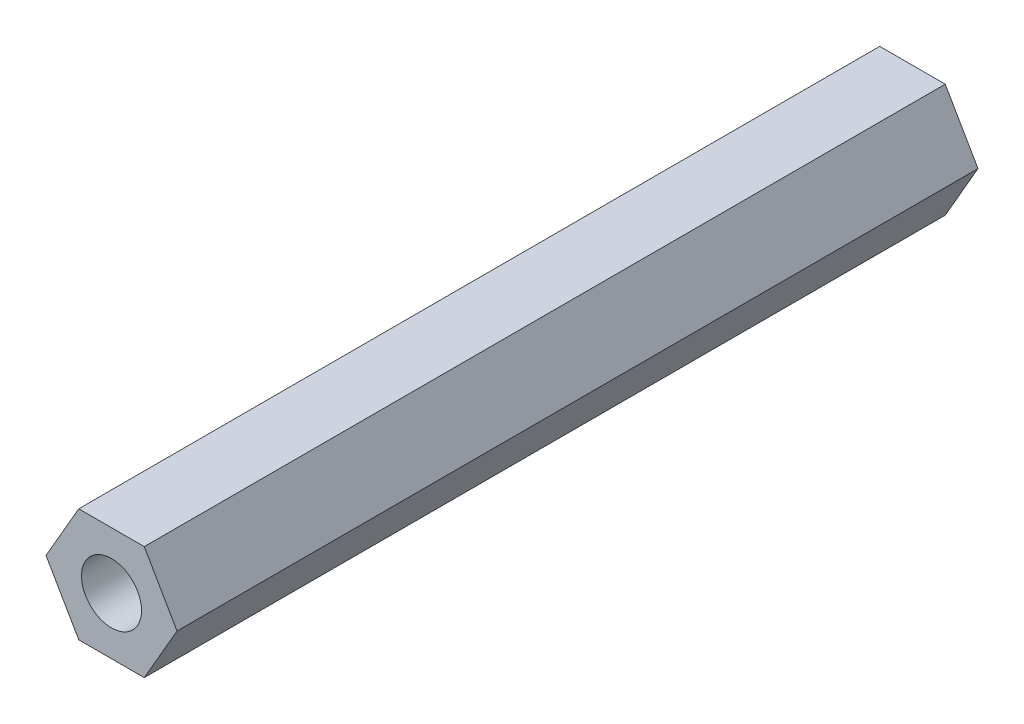
ISO-10303-21;
HEADER;
FILE_DESCRIPTION(('STEP AP214'),'2;1');
FILE_NAME('part.step','',(''),(''),'','','');
FILE_SCHEMA(('AUTOMOTIVE_DESIGN { 1 0 10303 214 1 1 1 1 }'));
ENDSEC;
DATA;
#1=APPLICATION_CONTEXT('core data for automotive mechanical design processes');
#2=APPLICATION_PROTOCOL_DEFINITION('international standard','automotive_design',2000,#1);
#3=PRODUCT_CONTEXT('',#1,'mechanical');
#4=PRODUCT('Part','Part','',(#3));
#5=PRODUCT_RELATED_PRODUCT_CATEGORY('part','',(#4));
#6=PRODUCT_DEFINITION_FORMATION('','',#4);
#7=PRODUCT_DEFINITION_CONTEXT('part definition',#1,'design');
#8=PRODUCT_DEFINITION('design','',#6,#7);
#9=PRODUCT_DEFINITION_SHAPE('','',#8);
#10=(LENGTH_UNIT() NAMED_UNIT(*) SI_UNIT(.MILLI.,.METRE.));
#11=(NAMED_UNIT(*) PLANE_ANGLE_UNIT() SI_UNIT($,.RADIAN.));
#12=(NAMED_UNIT(*) SI_UNIT($,.STERADIAN.) SOLID_ANGLE_UNIT());
#13=UNCERTAINTY_MEASURE_WITH_UNIT(LENGTH_MEASURE(1.E-05),#10,'distance_accuracy_value','');
#14=(GEOMETRIC_REPRESENTATION_CONTEXT(3) GLOBAL_UNCERTAINTY_ASSIGNED_CONTEXT((#13)) GLOBAL_UNIT_ASSIGNED_CONTEXT((#10,
#11,#12)) REPRESENTATION_CONTEXT('',''));
#15=CARTESIAN_POINT('',(0.,0.,0.));
#16=DIRECTION('',(0.,0.,1.));
#17=DIRECTION('',(1.,0.,0.));
#18=AXIS2_PLACEMENT_3D('',#15,#16,#17);
#19=CARTESIAN_POINT('',(0.,0.,60.));
#20=DIRECTION('',(0.,0.,1.));
#21=DIRECTION('',(1.,0.,0.));
#22=AXIS2_PLACEMENT_3D('',#19,#20,#21);
#23=PLANE('',#22);
#24=DIRECTION('',(0.5,0.866025403784439,0.));
#25=VECTOR('',#24,1.);
#26=CARTESIAN_POINT('',(2.45373864405591,-4.25,60.));
#27=LINE('',#26,#25);
#28=CARTESIAN_POINT('',(2.45373864405591,-4.25,60.));
#29=VERTEX_POINT('',#28);
#30=CARTESIAN_POINT('',(4.90747728811182,0.,60.));
#31=VERTEX_POINT('',#30);
#32=EDGE_CURVE('E132',#29,#31,#27,.T.);
#33=ORIENTED_EDGE('',*,*,#32,.T.);
#34=DIRECTION('',(-0.5,0.866025403784439,0.));
#35=VECTOR('',#34,1.);
#36=CARTESIAN_POINT('',(4.90747728811182,0.,60.));
#37=LINE('',#36,#35);
#38=CARTESIAN_POINT('',(2.45373864405591,4.25,60.));
#39=VERTEX_POINT('',#38);
#40=EDGE_CURVE('E90',#31,#39,#37,.T.);
#41=ORIENTED_EDGE('',*,*,#40,.T.);
#42=DIRECTION('',(-1.,0.,0.));
#43=VECTOR('',#42,1.);
#44=CARTESIAN_POINT('',(2.45373864405591,4.25,60.));
#45=LINE('',#44,#43);
#46=CARTESIAN_POINT('',(-2.45373864405591,4.25,60.));
#47=VERTEX_POINT('',#46);
#48=EDGE_CURVE('E103',#39,#47,#45,.T.);
#49=ORIENTED_EDGE('',*,*,#48,.T.);
#50=DIRECTION('',(-0.5,-0.866025403784439,0.));
#51=VECTOR('',#50,1.);
#52=CARTESIAN_POINT('',(-2.45373864405591,4.25,60.));
#53=LINE('',#52,#51);
#54=CARTESIAN_POINT('',(-4.90747728811182,0.,60.));
#55=VERTEX_POINT('',#54);
#56=EDGE_CURVE('E97',#47,#55,#53,.T.);
#57=ORIENTED_EDGE('',*,*,#56,.T.);
#58=DIRECTION('',(0.5,-0.866025403784438,0.));
#59=VECTOR('',#58,1.);
#60=CARTESIAN_POINT('',(-4.90747728811182,0.,60.));
#61=LINE('',#60,#59);
#62=CARTESIAN_POINT('',(-2.45373864405591,-4.25,60.));
#63=VERTEX_POINT('',#62);
#64=EDGE_CURVE('E101',#55,#63,#61,.T.);
#65=ORIENTED_EDGE('',*,*,#64,.T.);
#66=DIRECTION('',(1.,0.,0.));
#67=VECTOR('',#66,1.);
#68=CARTESIAN_POINT('',(-2.45373864405591,-4.25,60.));
#69=LINE('',#68,#67);
#70=EDGE_CURVE('E53',#63,#29,#69,.T.);
#71=ORIENTED_EDGE('',*,*,#70,.T.);
#72=EDGE_LOOP('',(#33,#41,#49,#57,#65,#71));
#73=FACE_BOUND('',#72,.T.);
#74=CARTESIAN_POINT('',(0.,0.,60.));
#75=DIRECTION('',(0.,0.,1.));
#76=DIRECTION('',(1.,0.,0.));
#77=AXIS2_PLACEMENT_3D('',#74,#75,#76);
#78=CIRCLE('',#77,2.25);
#79=CARTESIAN_POINT('',(2.25,0.,60.));
#80=VERTEX_POINT('',#79);
#81=EDGE_CURVE('E125',#80,#80,#78,.T.);
#82=ORIENTED_EDGE('',*,*,#81,.F.);
#83=EDGE_LOOP('',(#82));
#84=FACE_BOUND('',#83,.T.);
#85=ADVANCED_FACE('F36',(#73,#84),#23,.T.);
#86=CARTESIAN_POINT('',(0.,0.,0.));
#87=DIRECTION('',(0.,0.,1.));
#88=DIRECTION('',(1.,0.,0.));
#89=AXIS2_PLACEMENT_3D('',#86,#87,#88);
#90=PLANE('',#89);
#91=DIRECTION('',(0.5,0.866025403784439,0.));
#92=VECTOR('',#91,1.);
#93=CARTESIAN_POINT('',(2.45373864405591,-4.25,0.));
#94=LINE('',#93,#92);
#95=CARTESIAN_POINT('',(2.45373864405591,-4.25,0.));
#96=VERTEX_POINT('',#95);
#97=CARTESIAN_POINT('',(4.90747728811182,0.,0.));
#98=VERTEX_POINT('',#97);
#99=EDGE_CURVE('E121',#96,#98,#94,.T.);
#100=ORIENTED_EDGE('',*,*,#99,.F.);
#101=DIRECTION('',(1.,0.,0.));
#102=VECTOR('',#101,1.);
#103=CARTESIAN_POINT('',(-2.45373864405591,-4.25,0.));
#104=LINE('',#103,#102);
#105=CARTESIAN_POINT('',(-2.45373864405591,-4.25,0.));
#106=VERTEX_POINT('',#105);
#107=EDGE_CURVE('E82',#106,#96,#104,.T.);
#108=ORIENTED_EDGE('',*,*,#107,.F.);
#109=DIRECTION('',(0.5,-0.866025403784438,0.));
#110=VECTOR('',#109,1.);
#111=CARTESIAN_POINT('',(-4.90747728811182,0.,0.));
#112=LINE('',#111,#110);
#113=CARTESIAN_POINT('',(-4.90747728811182,0.,0.));
#114=VERTEX_POINT('',#113);
#115=EDGE_CURVE('E76',#114,#106,#112,.T.);
#116=ORIENTED_EDGE('',*,*,#115,.F.);
#117=DIRECTION('',(-0.5,-0.866025403784439,0.));
#118=VECTOR('',#117,1.);
#119=CARTESIAN_POINT('',(-2.45373864405591,4.25,0.));
#120=LINE('',#119,#118);
#121=CARTESIAN_POINT('',(-2.45373864405591,4.25,0.));
#122=VERTEX_POINT('',#121);
#123=EDGE_CURVE('E111',#122,#114,#120,.T.);
#124=ORIENTED_EDGE('',*,*,#123,.F.);
#125=DIRECTION('',(-1.,0.,0.));
#126=VECTOR('',#125,1.);
#127=CARTESIAN_POINT('',(2.45373864405591,4.25,0.));
#128=LINE('',#127,#126);
#129=CARTESIAN_POINT('',(2.45373864405591,4.25,0.));
#130=VERTEX_POINT('',#129);
#131=EDGE_CURVE('E127',#130,#122,#128,.T.);
#132=ORIENTED_EDGE('',*,*,#131,.F.);
#133=DIRECTION('',(-0.5,0.866025403784439,0.));
#134=VECTOR('',#133,1.);
#135=CARTESIAN_POINT('',(4.90747728811182,0.,0.));
#136=LINE('',#135,#134);
#137=EDGE_CURVE('E124',#98,#130,#136,.T.);
#138=ORIENTED_EDGE('',*,*,#137,.F.);
#139=EDGE_LOOP('',(#100,#108,#116,#124,#132,#138));
#140=FACE_BOUND('',#139,.T.);
#141=CARTESIAN_POINT('',(0.,0.,0.));
#142=DIRECTION('',(0.,0.,1.));
#143=DIRECTION('',(1.,0.,0.));
#144=AXIS2_PLACEMENT_3D('',#141,#142,#143);
#145=CIRCLE('',#144,2.25);
#146=CARTESIAN_POINT('',(2.25,0.,0.));
#147=VERTEX_POINT('',#146);
#148=EDGE_CURVE('E225',#147,#147,#145,.T.);
#149=ORIENTED_EDGE('',*,*,#148,.T.);
#150=EDGE_LOOP('',(#149));
#151=FACE_BOUND('',#150,.T.);
#152=ADVANCED_FACE('F141',(#140,#151),#90,.F.);
#153=CARTESIAN_POINT('',(2.45373864405591,-4.25,60.));
#154=DIRECTION('',(-0.866025403784439,0.5,0.));
#155=DIRECTION('',(-0.5,-0.866025403784439,0.));
#156=AXIS2_PLACEMENT_3D('',#153,#154,#155);
#157=PLANE('',#156);
#158=ORIENTED_EDGE('',*,*,#99,.T.);
#159=DIRECTION('',(0.,0.,-1.));
#160=VECTOR('',#159,1.);
#161=CARTESIAN_POINT('',(4.90747728811182,0.,60.));
#162=LINE('',#161,#160);
#163=EDGE_CURVE('E11',#31,#98,#162,.T.);
#164=ORIENTED_EDGE('',*,*,#163,.F.);
#165=ORIENTED_EDGE('',*,*,#32,.F.);
#166=DIRECTION('',(0.,0.,-1.));
#167=VECTOR('',#166,1.);
#168=CARTESIAN_POINT('',(2.45373864405591,-4.25,60.));
#169=LINE('',#168,#167);
#170=EDGE_CURVE('E117',#29,#96,#169,.T.);
#171=ORIENTED_EDGE('',*,*,#170,.T.);
#172=EDGE_LOOP('',(#158,#164,#165,#171));
#173=FACE_BOUND('',#172,.T.);
#174=ADVANCED_FACE('F38',(#173),#157,.F.);
#175=CARTESIAN_POINT('',(4.90747728811182,0.,60.));
#176=DIRECTION('',(-0.866025403784439,-0.5,0.));
#177=DIRECTION('',(0.5,-0.866025403784439,0.));
#178=AXIS2_PLACEMENT_3D('',#175,#176,#177);
#179=PLANE('',#178);
#180=ORIENTED_EDGE('',*,*,#137,.T.);
#181=DIRECTION('',(0.,0.,-1.));
#182=VECTOR('',#181,1.);
#183=CARTESIAN_POINT('',(2.45373864405591,4.25,60.));
#184=LINE('',#183,#182);
#185=EDGE_CURVE('E45',#39,#130,#184,.T.);
#186=ORIENTED_EDGE('',*,*,#185,.F.);
#187=ORIENTED_EDGE('',*,*,#40,.F.);
#188=ORIENTED_EDGE('',*,*,#163,.T.);
#189=EDGE_LOOP('',(#180,#186,#187,#188));
#190=FACE_BOUND('',#189,.T.);
#191=ADVANCED_FACE('F166',(#190),#179,.F.);
#192=CARTESIAN_POINT('',(2.45373864405591,4.25,60.));
#193=DIRECTION('',(0.,-1.,0.));
#194=DIRECTION('',(0.,0.,-1.));
#195=AXIS2_PLACEMENT_3D('',#192,#193,#194);
#196=PLANE('',#195);
#197=ORIENTED_EDGE('',*,*,#131,.T.);
#198=DIRECTION('',(0.,0.,-1.));
#199=VECTOR('',#198,1.);
#200=CARTESIAN_POINT('',(-2.45373864405591,4.25,60.));
#201=LINE('',#200,#199);
#202=EDGE_CURVE('E112',#47,#122,#201,.T.);
#203=ORIENTED_EDGE('',*,*,#202,.F.);
#204=ORIENTED_EDGE('',*,*,#48,.F.);
#205=ORIENTED_EDGE('',*,*,#185,.T.);
#206=EDGE_LOOP('',(#197,#203,#204,#205));
#207=FACE_BOUND('',#206,.T.);
#208=ADVANCED_FACE('F138',(#207),#196,.F.);
#209=CARTESIAN_POINT('',(-2.45373864405591,4.25,60.));
#210=DIRECTION('',(0.866025403784439,-0.5,0.));
#211=DIRECTION('',(0.5,0.866025403784439,0.));
#212=AXIS2_PLACEMENT_3D('',#209,#210,#211);
#213=PLANE('',#212);
#214=ORIENTED_EDGE('',*,*,#123,.T.);
#215=DIRECTION('',(0.,0.,-1.));
#216=VECTOR('',#215,1.);
#217=CARTESIAN_POINT('',(-4.90747728811182,0.,60.));
#218=LINE('',#217,#216);
#219=EDGE_CURVE('E108',#55,#114,#218,.T.);
#220=ORIENTED_EDGE('',*,*,#219,.F.);
#221=ORIENTED_EDGE('',*,*,#56,.F.);
#222=ORIENTED_EDGE('',*,*,#202,.T.);
#223=EDGE_LOOP('',(#214,#220,#221,#222));
#224=FACE_BOUND('',#223,.T.);
#225=ADVANCED_FACE('F109',(#224),#213,.F.);
#226=CARTESIAN_POINT('',(-4.90747728811182,0.,60.));
#227=DIRECTION('',(0.866025403784438,0.5,0.));
#228=DIRECTION('',(-0.5,0.866025403784439,0.));
#229=AXIS2_PLACEMENT_3D('',#226,#227,#228);
#230=PLANE('',#229);
#231=ORIENTED_EDGE('',*,*,#115,.T.);
#232=DIRECTION('',(0.,0.,-1.));
#233=VECTOR('',#232,1.);
#234=CARTESIAN_POINT('',(-2.45373864405591,-4.25,60.));
#235=LINE('',#234,#233);
#236=EDGE_CURVE('E113',#63,#106,#235,.T.);
#237=ORIENTED_EDGE('',*,*,#236,.F.);
#238=ORIENTED_EDGE('',*,*,#64,.F.);
#239=ORIENTED_EDGE('',*,*,#219,.T.);
#240=EDGE_LOOP('',(#231,#237,#238,#239));
#241=FACE_BOUND('',#240,.T.);
#242=ADVANCED_FACE('F115',(#241),#230,.F.);
#243=CARTESIAN_POINT('',(-2.45373864405591,-4.25,60.));
#244=DIRECTION('',(0.,1.,0.));
#245=DIRECTION('',(-1.,0.,0.));
#246=AXIS2_PLACEMENT_3D('',#243,#244,#245);
#247=PLANE('',#246);
#248=ORIENTED_EDGE('',*,*,#107,.T.);
#249=ORIENTED_EDGE('',*,*,#170,.F.);
#250=ORIENTED_EDGE('',*,*,#70,.F.);
#251=ORIENTED_EDGE('',*,*,#236,.T.);
#252=EDGE_LOOP('',(#248,#249,#250,#251));
#253=FACE_BOUND('',#252,.T.);
#254=ADVANCED_FACE('F146',(#253),#247,.F.);
#255=CARTESIAN_POINT('',(0.,0.,60.));
#256=DIRECTION('',(0.,0.,-1.));
#257=DIRECTION('',(-1.,0.,0.));
#258=AXIS2_PLACEMENT_3D('',#255,#256,#257);
#259=CYLINDRICAL_SURFACE('',#258,2.25);
#260=ORIENTED_EDGE('',*,*,#81,.T.);
#261=EDGE_LOOP('',(#260));
#262=FACE_BOUND('',#261,.T.);
#263=ORIENTED_EDGE('',*,*,#148,.F.);
#264=EDGE_LOOP('',(#263));
#265=FACE_BOUND('',#264,.T.);
#266=ADVANCED_FACE('F148',(#262,#265),#259,.F.);
#267=CLOSED_SHELL('',(#85,#152,#174,#191,#208,#225,#242,#254,#266));
#268=MANIFOLD_SOLID_BREP('B2',#267);
#269=ADVANCED_BREP_SHAPE_REPRESENTATION('',(#18,#268),#14);
#270=SHAPE_DEFINITION_REPRESENTATION(#9,#269);
ENDSEC;
END-ISO-10303-21;
